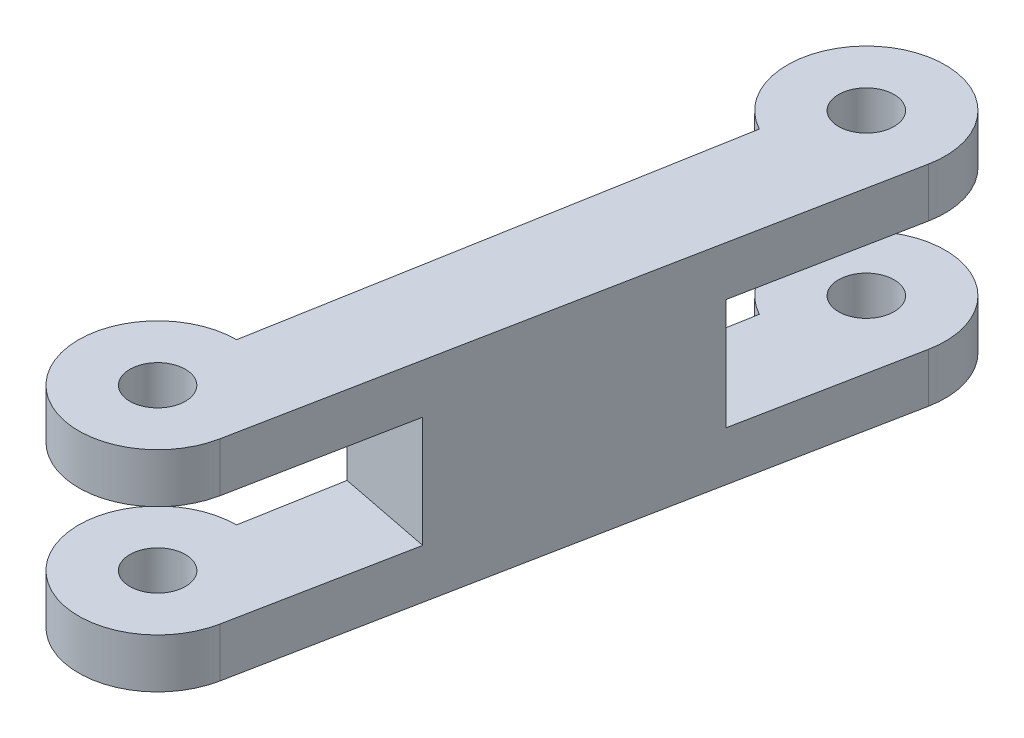
ISO-10303-21;
HEADER;
FILE_DESCRIPTION(('STEP AP214'),'2;1');
FILE_NAME('part.step','',(''),(''),'','','');
FILE_SCHEMA(('AUTOMOTIVE_DESIGN { 1 0 10303 214 1 1 1 1 }'));
ENDSEC;
DATA;
#1=APPLICATION_CONTEXT('core data for automotive mechanical design processes');
#2=APPLICATION_PROTOCOL_DEFINITION('international standard','automotive_design',2000,#1);
#3=PRODUCT_CONTEXT('',#1,'mechanical');
#4=PRODUCT('Part','Part','',(#3));
#5=PRODUCT_RELATED_PRODUCT_CATEGORY('part','',(#4));
#6=PRODUCT_DEFINITION_FORMATION('','',#4);
#7=PRODUCT_DEFINITION_CONTEXT('part definition',#1,'design');
#8=PRODUCT_DEFINITION('design','',#6,#7);
#9=PRODUCT_DEFINITION_SHAPE('','',#8);
#10=(LENGTH_UNIT() NAMED_UNIT(*) SI_UNIT(.MILLI.,.METRE.));
#11=(NAMED_UNIT(*) PLANE_ANGLE_UNIT() SI_UNIT($,.RADIAN.));
#12=(NAMED_UNIT(*) SI_UNIT($,.STERADIAN.) SOLID_ANGLE_UNIT());
#13=UNCERTAINTY_MEASURE_WITH_UNIT(LENGTH_MEASURE(1.E-05),#10,'distance_accuracy_value','');
#14=(GEOMETRIC_REPRESENTATION_CONTEXT(3) GLOBAL_UNCERTAINTY_ASSIGNED_CONTEXT((#13)) GLOBAL_UNIT_ASSIGNED_CONTEXT((#10,
#11,#12)) REPRESENTATION_CONTEXT('',''));
#15=CARTESIAN_POINT('',(0.,0.,0.));
#16=DIRECTION('',(0.,0.,1.));
#17=DIRECTION('',(1.,0.,0.));
#18=AXIS2_PLACEMENT_3D('',#15,#16,#17);
#19=CARTESIAN_POINT('',(-61.1949578899378,8.5,-40.8775039517998));
#20=DIRECTION('',(0.,-1.,0.));
#21=DIRECTION('',(0.,0.,-1.));
#22=AXIS2_PLACEMENT_3D('',#19,#20,#21);
#23=CYLINDRICAL_SURFACE('',#22,3.2);
#24=DIRECTION('',(0.,-1.,0.));
#25=VECTOR('',#24,1.);
#26=CARTESIAN_POINT('',(-58.0549880466162,8.5,-40.2605846839607));
#27=LINE('',#26,#25);
#28=CARTESIAN_POINT('',(-58.0549880466162,2.,-40.2605846839607));
#29=VERTEX_POINT('',#28);
#30=CARTESIAN_POINT('',(-58.0549880466162,0.,-40.2605846839607));
#31=VERTEX_POINT('',#30);
#32=EDGE_CURVE('E224',#29,#31,#27,.T.);
#33=ORIENTED_EDGE('',*,*,#32,.F.);
#34=CARTESIAN_POINT('',(-61.1949578899378,2.,-40.8775039517998));
#35=DIRECTION('',(0.,-1.,0.));
#36=DIRECTION('',(0.,0.,-1.));
#37=AXIS2_PLACEMENT_3D('',#34,#35,#36);
#38=CIRCLE('',#37,3.2);
#39=CARTESIAN_POINT('',(-61.1949578899378,2.,-44.0775039517998));
#40=VERTEX_POINT('',#39);
#41=EDGE_CURVE('E138',#29,#40,#38,.T.);
#42=ORIENTED_EDGE('',*,*,#41,.T.);
#43=DIRECTION('',(0.,-1.,0.));
#44=VECTOR('',#43,1.);
#45=CARTESIAN_POINT('',(-61.1949578899378,8.5,-44.0775039517998));
#46=LINE('',#45,#44);
#47=CARTESIAN_POINT('',(-61.1949578899378,0.,-44.0775039517998));
#48=VERTEX_POINT('',#47);
#49=EDGE_CURVE('E227',#40,#48,#46,.T.);
#50=ORIENTED_EDGE('',*,*,#49,.T.);
#51=CARTESIAN_POINT('',(-61.1949578899378,0.,-40.8775039517998));
#52=DIRECTION('',(0.,1.,0.));
#53=DIRECTION('',(0.,0.,1.));
#54=AXIS2_PLACEMENT_3D('',#51,#52,#53);
#55=CIRCLE('',#54,3.2);
#56=EDGE_CURVE('E216',#48,#31,#55,.T.);
#57=ORIENTED_EDGE('',*,*,#56,.T.);
#58=EDGE_LOOP('',(#33,#42,#50,#57));
#59=FACE_BOUND('',#58,.T.);
#60=ADVANCED_FACE('F33',(#59),#23,.T.);
#61=CARTESIAN_POINT('',(-61.1949578899378,8.5,-40.8775039517998));
#62=DIRECTION('',(0.,-1.,0.));
#63=DIRECTION('',(0.,0.,-1.));
#64=AXIS2_PLACEMENT_3D('',#61,#62,#63);
#65=CYLINDRICAL_SURFACE('',#64,1.125);
#66=CARTESIAN_POINT('',(-61.1949578899378,2.,-40.8775039517998));
#67=DIRECTION('',(0.,-1.,0.));
#68=DIRECTION('',(0.,0.,-1.));
#69=AXIS2_PLACEMENT_3D('',#66,#67,#68);
#70=CIRCLE('',#69,1.125);
#71=CARTESIAN_POINT('',(-61.1949578899378,2.,-42.0025039517998));
#72=VERTEX_POINT('',#71);
#73=EDGE_CURVE('E37',#72,#72,#70,.T.);
#74=ORIENTED_EDGE('',*,*,#73,.F.);
#75=EDGE_LOOP('',(#74));
#76=FACE_BOUND('',#75,.T.);
#77=CARTESIAN_POINT('',(-61.1949578899378,0.,-40.8775039517998));
#78=DIRECTION('',(0.,1.,0.));
#79=DIRECTION('',(0.,0.,1.));
#80=AXIS2_PLACEMENT_3D('',#77,#78,#79);
#81=CIRCLE('',#80,1.125);
#82=CARTESIAN_POINT('',(-61.1949578899378,0.,-39.7525039517998));
#83=VERTEX_POINT('',#82);
#84=EDGE_CURVE('E187',#83,#83,#81,.T.);
#85=ORIENTED_EDGE('',*,*,#84,.F.);
#86=EDGE_LOOP('',(#85));
#87=FACE_BOUND('',#86,.T.);
#88=ADVANCED_FACE('F246',(#76,#87),#65,.F.);
#89=CARTESIAN_POINT('',(-56.4794724284142,8.5,-64.8781842963553));
#90=DIRECTION('',(0.,-1.,0.));
#91=DIRECTION('',(0.,0.,-1.));
#92=AXIS2_PLACEMENT_3D('',#89,#90,#91);
#93=CYLINDRICAL_SURFACE('',#92,3.2);
#94=DIRECTION('',(0.,-1.,0.));
#95=VECTOR('',#94,1.);
#96=CARTESIAN_POINT('',(-53.3395025850926,8.5,-64.2612650285162));
#97=LINE('',#96,#95);
#98=CARTESIAN_POINT('',(-53.3395025850926,8.5,-64.2612650285162));
#99=VERTEX_POINT('',#98);
#100=CARTESIAN_POINT('',(-53.3395025850926,6.5,-64.2612650285162));
#101=VERTEX_POINT('',#100);
#102=EDGE_CURVE('E221',#99,#101,#97,.T.);
#103=ORIENTED_EDGE('',*,*,#102,.T.);
#104=CARTESIAN_POINT('',(-56.4794724284142,6.5,-64.8781842963553));
#105=DIRECTION('',(0.,1.,0.));
#106=DIRECTION('',(0.,0.,1.));
#107=AXIS2_PLACEMENT_3D('',#104,#105,#106);
#108=CIRCLE('',#107,3.2);
#109=CARTESIAN_POINT('',(-57.9949578899378,6.5,-62.0597975564081));
#110=VERTEX_POINT('',#109);
#111=EDGE_CURVE('E181',#101,#110,#108,.T.);
#112=ORIENTED_EDGE('',*,*,#111,.T.);
#113=DIRECTION('',(0.,-1.,0.));
#114=VECTOR('',#113,1.);
#115=CARTESIAN_POINT('',(-57.9949578899378,8.5,-62.0597975564081));
#116=LINE('',#115,#114);
#117=CARTESIAN_POINT('',(-57.9949578899378,8.5,-62.0597975564081));
#118=VERTEX_POINT('',#117);
#119=EDGE_CURVE('E11',#118,#110,#116,.T.);
#120=ORIENTED_EDGE('',*,*,#119,.F.);
#121=CARTESIAN_POINT('',(-56.4794724284142,8.5,-64.8781842963553));
#122=DIRECTION('',(0.,1.,0.));
#123=DIRECTION('',(0.,0.,1.));
#124=AXIS2_PLACEMENT_3D('',#121,#122,#123);
#125=CIRCLE('',#124,3.2);
#126=EDGE_CURVE('E200',#99,#118,#125,.T.);
#127=ORIENTED_EDGE('',*,*,#126,.F.);
#128=EDGE_LOOP('',(#103,#112,#120,#127));
#129=FACE_BOUND('',#128,.T.);
#130=ADVANCED_FACE('F261',(#129),#93,.T.);
#131=CARTESIAN_POINT('',(-56.4794724284142,8.5,-64.8781842963553));
#132=DIRECTION('',(0.,-1.,0.));
#133=DIRECTION('',(0.,0.,-1.));
#134=AXIS2_PLACEMENT_3D('',#131,#132,#133);
#135=CYLINDRICAL_SURFACE('',#134,1.125);
#136=CARTESIAN_POINT('',(-56.4794724284142,6.5,-64.8781842963553));
#137=DIRECTION('',(0.,1.,0.));
#138=DIRECTION('',(0.,0.,1.));
#139=AXIS2_PLACEMENT_3D('',#136,#137,#138);
#140=CIRCLE('',#139,1.125);
#141=CARTESIAN_POINT('',(-56.4794724284142,6.5,-63.7531842963554));
#142=VERTEX_POINT('',#141);
#143=EDGE_CURVE('E177',#142,#142,#140,.T.);
#144=ORIENTED_EDGE('',*,*,#143,.F.);
#145=EDGE_LOOP('',(#144));
#146=FACE_BOUND('',#145,.T.);
#147=CARTESIAN_POINT('',(-56.4794724284142,8.5,-64.8781842963553));
#148=DIRECTION('',(0.,1.,0.));
#149=DIRECTION('',(0.,0.,1.));
#150=AXIS2_PLACEMENT_3D('',#147,#148,#149);
#151=CIRCLE('',#150,1.125);
#152=CARTESIAN_POINT('',(-56.4794724284142,8.5,-63.7531842963554));
#153=VERTEX_POINT('',#152);
#154=EDGE_CURVE('E194',#153,#153,#151,.T.);
#155=ORIENTED_EDGE('',*,*,#154,.T.);
#156=EDGE_LOOP('',(#155));
#157=FACE_BOUND('',#156,.T.);
#158=ADVANCED_FACE('F252',(#146,#157),#135,.F.);
#159=CARTESIAN_POINT('',(-56.4794724284142,8.5,-64.8781842963553));
#160=DIRECTION('',(0.,1.,0.));
#161=DIRECTION('',(0.,0.,1.));
#162=AXIS2_PLACEMENT_3D('',#159,#160,#161);
#163=PLANE('',#162);
#164=ORIENTED_EDGE('',*,*,#154,.F.);
#165=EDGE_LOOP('',(#164));
#166=FACE_BOUND('',#165,.T.);
#167=ORIENTED_EDGE('',*,*,#126,.T.);
#168=DIRECTION('',(-0.17520039483039,0.,0.984532793588551));
#169=VECTOR('',#168,1.);
#170=CARTESIAN_POINT('',(-57.9949578899378,8.5,-62.0597975564081));
#171=LINE('',#170,#169);
#172=CARTESIAN_POINT('',(-61.1949578899378,8.5,-44.0775039517998));
#173=VERTEX_POINT('',#172);
#174=EDGE_CURVE('E203',#118,#173,#171,.T.);
#175=ORIENTED_EDGE('',*,*,#174,.T.);
#176=CARTESIAN_POINT('',(-61.1949578899378,8.5,-40.8775039517998));
#177=DIRECTION('',(0.,1.,0.));
#178=DIRECTION('',(0.,0.,1.));
#179=AXIS2_PLACEMENT_3D('',#176,#177,#178);
#180=CIRCLE('',#179,3.2);
#181=CARTESIAN_POINT('',(-58.0549880466162,8.5,-40.2605846839607));
#182=VERTEX_POINT('',#181);
#183=EDGE_CURVE('E206',#173,#182,#180,.T.);
#184=ORIENTED_EDGE('',*,*,#183,.T.);
#185=DIRECTION('',(0.192787271199743,0.,-0.981240576037985));
#186=VECTOR('',#185,1.);
#187=CARTESIAN_POINT('',(-53.3395025850926,8.5,-64.2612650285162));
#188=LINE('',#187,#186);
#189=EDGE_CURVE('E208',#182,#99,#188,.T.);
#190=ORIENTED_EDGE('',*,*,#189,.T.);
#191=EDGE_LOOP('',(#167,#175,#184,#190));
#192=FACE_BOUND('',#191,.T.);
#193=CARTESIAN_POINT('',(-61.1949578899378,8.5,-40.8775039517998));
#194=DIRECTION('',(0.,1.,0.));
#195=DIRECTION('',(0.,0.,1.));
#196=AXIS2_PLACEMENT_3D('',#193,#194,#195);
#197=CIRCLE('',#196,1.125);
#198=CARTESIAN_POINT('',(-61.1949578899378,8.5,-39.7525039517998));
#199=VERTEX_POINT('',#198);
#200=EDGE_CURVE('E188',#199,#199,#197,.T.);
#201=ORIENTED_EDGE('',*,*,#200,.F.);
#202=EDGE_LOOP('',(#201));
#203=FACE_BOUND('',#202,.T.);
#204=ADVANCED_FACE('F249',(#166,#192,#203),#163,.T.);
#205=CARTESIAN_POINT('',(-56.4794724284142,0.,-64.8781842963553));
#206=DIRECTION('',(0.,1.,0.));
#207=DIRECTION('',(0.,0.,1.));
#208=AXIS2_PLACEMENT_3D('',#205,#206,#207);
#209=PLANE('',#208);
#210=CARTESIAN_POINT('',(-56.4794724284142,0.,-64.8781842963553));
#211=DIRECTION('',(0.,1.,0.));
#212=DIRECTION('',(0.,0.,1.));
#213=AXIS2_PLACEMENT_3D('',#210,#211,#212);
#214=CIRCLE('',#213,3.2);
#215=CARTESIAN_POINT('',(-53.3395025850926,0.,-64.2612650285162));
#216=VERTEX_POINT('',#215);
#217=CARTESIAN_POINT('',(-57.9949578899378,0.,-62.0597975564081));
#218=VERTEX_POINT('',#217);
#219=EDGE_CURVE('E197',#216,#218,#214,.T.);
#220=ORIENTED_EDGE('',*,*,#219,.F.);
#221=DIRECTION('',(0.192787271199743,0.,-0.981240576037985));
#222=VECTOR('',#221,1.);
#223=CARTESIAN_POINT('',(-53.3395025850926,0.,-64.2612650285162));
#224=LINE('',#223,#222);
#225=EDGE_CURVE('E204',#31,#216,#224,.T.);
#226=ORIENTED_EDGE('',*,*,#225,.F.);
#227=ORIENTED_EDGE('',*,*,#56,.F.);
#228=DIRECTION('',(-0.17520039483039,0.,0.984532793588551));
#229=VECTOR('',#228,1.);
#230=CARTESIAN_POINT('',(-57.9949578899378,0.,-62.0597975564081));
#231=LINE('',#230,#229);
#232=EDGE_CURVE('E213',#218,#48,#231,.T.);
#233=ORIENTED_EDGE('',*,*,#232,.F.);
#234=EDGE_LOOP('',(#220,#226,#227,#233));
#235=FACE_BOUND('',#234,.T.);
#236=CARTESIAN_POINT('',(-56.4794724284142,0.,-64.8781842963553));
#237=DIRECTION('',(0.,1.,0.));
#238=DIRECTION('',(0.,0.,1.));
#239=AXIS2_PLACEMENT_3D('',#236,#237,#238);
#240=CIRCLE('',#239,1.125);
#241=CARTESIAN_POINT('',(-56.4794724284142,0.,-63.7531842963554));
#242=VERTEX_POINT('',#241);
#243=EDGE_CURVE('E191',#242,#242,#240,.T.);
#244=ORIENTED_EDGE('',*,*,#243,.T.);
#245=EDGE_LOOP('',(#244));
#246=FACE_BOUND('',#245,.T.);
#247=ORIENTED_EDGE('',*,*,#84,.T.);
#248=EDGE_LOOP('',(#247));
#249=FACE_BOUND('',#248,.T.);
#250=ADVANCED_FACE('F251',(#235,#246,#249),#209,.F.);
#251=CARTESIAN_POINT('',(-57.9949578899378,2.,-62.0597975564081));
#252=VERTEX_POINT('',#251);
#253=EDGE_CURVE('E42',#252,#218,#116,.T.);
#254=ORIENTED_EDGE('',*,*,#253,.F.);
#255=CARTESIAN_POINT('',(-56.4794724284142,2.,-64.8781842963553));
#256=DIRECTION('',(0.,-1.,0.));
#257=DIRECTION('',(0.,0.,-1.));
#258=AXIS2_PLACEMENT_3D('',#255,#256,#257);
#259=CIRCLE('',#258,3.2);
#260=CARTESIAN_POINT('',(-53.3395025850926,2.,-64.2612650285162));
#261=VERTEX_POINT('',#260);
#262=EDGE_CURVE('E174',#252,#261,#259,.T.);
#263=ORIENTED_EDGE('',*,*,#262,.T.);
#264=EDGE_CURVE('E210',#261,#216,#97,.T.);
#265=ORIENTED_EDGE('',*,*,#264,.T.);
#266=ORIENTED_EDGE('',*,*,#219,.T.);
#267=EDGE_LOOP('',(#254,#263,#265,#266));
#268=FACE_BOUND('',#267,.T.);
#269=ADVANCED_FACE('F35',(#268),#93,.T.);
#270=CARTESIAN_POINT('',(-57.9949578899378,8.5,-62.0597975564081));
#271=DIRECTION('',(0.984532793588551,0.,0.17520039483039));
#272=DIRECTION('',(0.17520039483039,0.,-0.984532793588551));
#273=AXIS2_PLACEMENT_3D('',#270,#271,#272);
#274=PLANE('',#273);
#275=ORIENTED_EDGE('',*,*,#49,.F.);
#276=DIRECTION('',(0.17520039483039,0.,-0.984532793588551));
#277=VECTOR('',#276,1.);
#278=CARTESIAN_POINT('',(-57.9949578899378,2.,-62.0597975564081));
#279=LINE('',#278,#277);
#280=CARTESIAN_POINT('',(-60.518570814194,2.,-47.8784386350458));
#281=VERTEX_POINT('',#280);
#282=EDGE_CURVE('E157',#40,#281,#279,.T.);
#283=ORIENTED_EDGE('',*,*,#282,.T.);
#284=DIRECTION('',(0.,1.,0.));
#285=VECTOR('',#284,1.);
#286=CARTESIAN_POINT('',(-60.518570814194,8.5,-47.8784386350458));
#287=LINE('',#286,#285);
#288=CARTESIAN_POINT('',(-60.518570814194,6.5,-47.8784386350458));
#289=VERTEX_POINT('',#288);
#290=EDGE_CURVE('E128',#281,#289,#287,.T.);
#291=ORIENTED_EDGE('',*,*,#290,.T.);
#292=DIRECTION('',(-0.17520039483039,0.,0.984532793588551));
#293=VECTOR('',#292,1.);
#294=CARTESIAN_POINT('',(-57.9949578899378,6.5,-62.0597975564081));
#295=LINE('',#294,#293);
#296=CARTESIAN_POINT('',(-61.1949578899378,6.5,-44.0775039517998));
#297=VERTEX_POINT('',#296);
#298=EDGE_CURVE('E153',#289,#297,#295,.T.);
#299=ORIENTED_EDGE('',*,*,#298,.T.);
#300=EDGE_CURVE('E228',#173,#297,#46,.T.);
#301=ORIENTED_EDGE('',*,*,#300,.F.);
#302=ORIENTED_EDGE('',*,*,#174,.F.);
#303=ORIENTED_EDGE('',*,*,#119,.T.);
#304=DIRECTION('',(-0.17520039483039,0.,0.984532793588551));
#305=VECTOR('',#304,1.);
#306=CARTESIAN_POINT('',(-57.9949578899378,6.5,-62.0597975564081));
#307=LINE('',#306,#305);
#308=CARTESIAN_POINT('',(-58.6857641828334,6.5,-58.1778345617959));
#309=VERTEX_POINT('',#308);
#310=EDGE_CURVE('E178',#110,#309,#307,.T.);
#311=ORIENTED_EDGE('',*,*,#310,.T.);
#312=DIRECTION('',(0.,-1.,0.));
#313=VECTOR('',#312,1.);
#314=CARTESIAN_POINT('',(-58.6857641828334,8.5,-58.1778345617959));
#315=LINE('',#314,#313);
#316=CARTESIAN_POINT('',(-58.6857641828334,2.,-58.1778345617959));
#317=VERTEX_POINT('',#316);
#318=EDGE_CURVE('E184',#309,#317,#315,.T.);
#319=ORIENTED_EDGE('',*,*,#318,.T.);
#320=DIRECTION('',(0.17520039483039,0.,-0.984532793588551));
#321=VECTOR('',#320,1.);
#322=CARTESIAN_POINT('',(-57.9949578899378,2.,-62.0597975564081));
#323=LINE('',#322,#321);
#324=EDGE_CURVE('E171',#317,#252,#323,.T.);
#325=ORIENTED_EDGE('',*,*,#324,.T.);
#326=ORIENTED_EDGE('',*,*,#253,.T.);
#327=ORIENTED_EDGE('',*,*,#232,.T.);
#328=EDGE_LOOP('',(#275,#283,#291,#299,#301,#302,#303,#311,#319,#325,#326,#327));
#329=FACE_BOUND('',#328,.T.);
#330=ADVANCED_FACE('F276',(#329),#274,.F.);
#331=ORIENTED_EDGE('',*,*,#300,.T.);
#332=CARTESIAN_POINT('',(-61.1949578899378,6.5,-40.8775039517998));
#333=DIRECTION('',(0.,1.,0.));
#334=DIRECTION('',(0.,0.,1.));
#335=AXIS2_PLACEMENT_3D('',#332,#333,#334);
#336=CIRCLE('',#335,3.2);
#337=CARTESIAN_POINT('',(-58.0549880466162,6.5,-40.2605846839607));
#338=VERTEX_POINT('',#337);
#339=EDGE_CURVE('E150',#297,#338,#336,.T.);
#340=ORIENTED_EDGE('',*,*,#339,.T.);
#341=EDGE_CURVE('E225',#182,#338,#27,.T.);
#342=ORIENTED_EDGE('',*,*,#341,.F.);
#343=ORIENTED_EDGE('',*,*,#183,.F.);
#344=EDGE_LOOP('',(#331,#340,#342,#343));
#345=FACE_BOUND('',#344,.T.);
#346=ADVANCED_FACE('F269',(#345),#23,.T.);
#347=CARTESIAN_POINT('',(-53.3395025850926,8.5,-64.2612650285162));
#348=DIRECTION('',(-0.981240576037985,0.,-0.192787271199743));
#349=DIRECTION('',(-0.192787271199743,0.,0.981240576037985));
#350=AXIS2_PLACEMENT_3D('',#347,#348,#349);
#351=PLANE('',#350);
#352=DIRECTION('',(0.,1.,0.));
#353=VECTOR('',#352,1.);
#354=CARTESIAN_POINT('',(-56.705477148218,6.5,-47.1292687162265));
#355=LINE('',#354,#353);
#356=CARTESIAN_POINT('',(-56.705477148218,2.,-47.1292687162265));
#357=VERTEX_POINT('',#356);
#358=CARTESIAN_POINT('',(-56.705477148218,6.5,-47.1292687162266));
#359=VERTEX_POINT('',#358);
#360=EDGE_CURVE('E50',#357,#359,#355,.T.);
#361=ORIENTED_EDGE('',*,*,#360,.F.);
#362=DIRECTION('',(0.192787271199743,0.,-0.981240576037985));
#363=VECTOR('',#362,1.);
#364=CARTESIAN_POINT('',(-56.705477148218,2.,-47.1292687162265));
#365=LINE('',#364,#363);
#366=EDGE_CURVE('E135',#29,#357,#365,.T.);
#367=ORIENTED_EDGE('',*,*,#366,.F.);
#368=ORIENTED_EDGE('',*,*,#32,.T.);
#369=ORIENTED_EDGE('',*,*,#225,.T.);
#370=ORIENTED_EDGE('',*,*,#264,.F.);
#371=DIRECTION('',(0.192787271199743,0.,-0.981240576037985));
#372=VECTOR('',#371,1.);
#373=CARTESIAN_POINT('',(-54.6890134834908,2.,-57.3925809962503));
#374=LINE('',#373,#372);
#375=CARTESIAN_POINT('',(-54.6890134834908,2.,-57.3925809962503));
#376=VERTEX_POINT('',#375);
#377=EDGE_CURVE('E161',#376,#261,#374,.T.);
#378=ORIENTED_EDGE('',*,*,#377,.F.);
#379=DIRECTION('',(0.,-1.,0.));
#380=VECTOR('',#379,1.);
#381=CARTESIAN_POINT('',(-54.6890134834908,6.5,-57.3925809962503));
#382=LINE('',#381,#380);
#383=CARTESIAN_POINT('',(-54.6890134834908,6.5,-57.3925809962503));
#384=VERTEX_POINT('',#383);
#385=EDGE_CURVE('E58',#384,#376,#382,.T.);
#386=ORIENTED_EDGE('',*,*,#385,.F.);
#387=DIRECTION('',(-0.192787271199743,0.,0.981240576037985));
#388=VECTOR('',#387,1.);
#389=CARTESIAN_POINT('',(-54.6890134834908,6.5,-57.3925809962503));
#390=LINE('',#389,#388);
#391=EDGE_CURVE('E163',#101,#384,#390,.T.);
#392=ORIENTED_EDGE('',*,*,#391,.F.);
#393=ORIENTED_EDGE('',*,*,#102,.F.);
#394=ORIENTED_EDGE('',*,*,#189,.F.);
#395=ORIENTED_EDGE('',*,*,#341,.T.);
#396=DIRECTION('',(-0.192787271199743,0.,0.981240576037985));
#397=VECTOR('',#396,1.);
#398=CARTESIAN_POINT('',(-56.705477148218,6.5,-47.1292687162265));
#399=LINE('',#398,#397);
#400=EDGE_CURVE('E141',#359,#338,#399,.T.);
#401=ORIENTED_EDGE('',*,*,#400,.F.);
#402=EDGE_LOOP('',(#361,#367,#368,#369,#370,#378,#386,#392,#393,#394,#395,#401));
#403=FACE_BOUND('',#402,.T.);
#404=ADVANCED_FACE('F144',(#403),#351,.F.);
#405=CARTESIAN_POINT('',(-56.4794724284142,2.,-64.8781842963553));
#406=DIRECTION('',(0.,-1.,0.));
#407=DIRECTION('',(0.,0.,-1.));
#408=AXIS2_PLACEMENT_3D('',#405,#406,#407);
#409=CIRCLE('',#408,1.125);
#410=CARTESIAN_POINT('',(-56.4794724284142,2.,-66.0031842963553));
#411=VERTEX_POINT('',#410);
#412=EDGE_CURVE('E169',#411,#411,#409,.T.);
#413=ORIENTED_EDGE('',*,*,#412,.F.);
#414=EDGE_LOOP('',(#413));
#415=FACE_BOUND('',#414,.T.);
#416=ORIENTED_EDGE('',*,*,#243,.F.);
#417=EDGE_LOOP('',(#416));
#418=FACE_BOUND('',#417,.T.);
#419=ADVANCED_FACE('F244',(#415,#418),#135,.F.);
#420=CARTESIAN_POINT('',(-61.1949578899378,6.5,-40.8775039517998));
#421=DIRECTION('',(0.,1.,0.));
#422=DIRECTION('',(0.,0.,1.));
#423=AXIS2_PLACEMENT_3D('',#420,#421,#422);
#424=CIRCLE('',#423,1.125);
#425=CARTESIAN_POINT('',(-61.1949578899378,6.5,-39.7525039517998));
#426=VERTEX_POINT('',#425);
#427=EDGE_CURVE('E131',#426,#426,#424,.T.);
#428=ORIENTED_EDGE('',*,*,#427,.F.);
#429=EDGE_LOOP('',(#428));
#430=FACE_BOUND('',#429,.T.);
#431=ORIENTED_EDGE('',*,*,#200,.T.);
#432=EDGE_LOOP('',(#431));
#433=FACE_BOUND('',#432,.T.);
#434=ADVANCED_FACE('F240',(#430,#433),#65,.F.);
#435=CARTESIAN_POINT('',(-63.0295583798137,6.5,-59.0312728014481));
#436=DIRECTION('',(-0.192787271199743,0.,0.981240576037985));
#437=DIRECTION('',(0.981240576037985,0.,0.192787271199743));
#438=AXIS2_PLACEMENT_3D('',#435,#436,#437);
#439=PLANE('',#438);
#440=DIRECTION('',(0.981240576037985,0.,0.192787271199743));
#441=VECTOR('',#440,1.);
#442=CARTESIAN_POINT('',(-63.0295583798137,6.5,-59.0312728014481));
#443=LINE('',#442,#441);
#444=EDGE_CURVE('E167',#309,#384,#443,.T.);
#445=ORIENTED_EDGE('',*,*,#444,.T.);
#446=ORIENTED_EDGE('',*,*,#385,.T.);
#447=DIRECTION('',(0.981240576037985,0.,0.192787271199743));
#448=VECTOR('',#447,1.);
#449=CARTESIAN_POINT('',(-63.0295583798137,2.,-59.0312728014481));
#450=LINE('',#449,#448);
#451=EDGE_CURVE('E166',#317,#376,#450,.T.);
#452=ORIENTED_EDGE('',*,*,#451,.F.);
#453=ORIENTED_EDGE('',*,*,#318,.F.);
#454=EDGE_LOOP('',(#445,#446,#452,#453));
#455=FACE_BOUND('',#454,.T.);
#456=ADVANCED_FACE('F243',(#455),#439,.F.);
#457=CARTESIAN_POINT('',(-63.0295583798137,6.5,-59.0312728014481));
#458=DIRECTION('',(0.,1.,0.));
#459=DIRECTION('',(0.,0.,1.));
#460=AXIS2_PLACEMENT_3D('',#457,#458,#459);
#461=PLANE('',#460);
#462=ORIENTED_EDGE('',*,*,#143,.T.);
#463=EDGE_LOOP('',(#462));
#464=FACE_BOUND('',#463,.T.);
#465=ORIENTED_EDGE('',*,*,#391,.T.);
#466=ORIENTED_EDGE('',*,*,#444,.F.);
#467=ORIENTED_EDGE('',*,*,#310,.F.);
#468=ORIENTED_EDGE('',*,*,#111,.F.);
#469=EDGE_LOOP('',(#465,#466,#467,#468));
#470=FACE_BOUND('',#469,.T.);
#471=ADVANCED_FACE('F298',(#464,#470),#461,.F.);
#472=CARTESIAN_POINT('',(-63.0295583798137,2.,-59.0312728014481));
#473=DIRECTION('',(0.,-1.,0.));
#474=DIRECTION('',(0.,0.,-1.));
#475=AXIS2_PLACEMENT_3D('',#472,#473,#474);
#476=PLANE('',#475);
#477=ORIENTED_EDGE('',*,*,#412,.T.);
#478=EDGE_LOOP('',(#477));
#479=FACE_BOUND('',#478,.T.);
#480=ORIENTED_EDGE('',*,*,#324,.F.);
#481=ORIENTED_EDGE('',*,*,#451,.T.);
#482=ORIENTED_EDGE('',*,*,#377,.T.);
#483=ORIENTED_EDGE('',*,*,#262,.F.);
#484=EDGE_LOOP('',(#480,#481,#482,#483));
#485=FACE_BOUND('',#484,.T.);
#486=ADVANCED_FACE('F297',(#479,#485),#476,.F.);
#487=CARTESIAN_POINT('',(-65.0460220445409,6.5,-48.7679605214244));
#488=DIRECTION('',(0.192787271199743,0.,-0.981240576037985));
#489=DIRECTION('',(-0.981240576037985,0.,-0.192787271199743));
#490=AXIS2_PLACEMENT_3D('',#487,#488,#489);
#491=PLANE('',#490);
#492=DIRECTION('',(0.981240576037985,0.,0.192787271199743));
#493=VECTOR('',#492,1.);
#494=CARTESIAN_POINT('',(-65.0460220445409,2.,-48.7679605214244));
#495=LINE('',#494,#493);
#496=EDGE_CURVE('E124',#281,#357,#495,.T.);
#497=ORIENTED_EDGE('',*,*,#496,.T.);
#498=ORIENTED_EDGE('',*,*,#360,.T.);
#499=DIRECTION('',(0.981240576037985,0.,0.192787271199743));
#500=VECTOR('',#499,1.);
#501=CARTESIAN_POINT('',(-65.0460220445409,6.5,-48.7679605214244));
#502=LINE('',#501,#500);
#503=EDGE_CURVE('E132',#289,#359,#502,.T.);
#504=ORIENTED_EDGE('',*,*,#503,.F.);
#505=ORIENTED_EDGE('',*,*,#290,.F.);
#506=EDGE_LOOP('',(#497,#498,#504,#505));
#507=FACE_BOUND('',#506,.T.);
#508=ADVANCED_FACE('F126',(#507),#491,.F.);
#509=CARTESIAN_POINT('',(-65.0460220445409,2.,-48.7679605214244));
#510=DIRECTION('',(0.,-1.,0.));
#511=DIRECTION('',(0.,0.,-1.));
#512=AXIS2_PLACEMENT_3D('',#509,#510,#511);
#513=PLANE('',#512);
#514=ORIENTED_EDGE('',*,*,#73,.T.);
#515=EDGE_LOOP('',(#514));
#516=FACE_BOUND('',#515,.T.);
#517=ORIENTED_EDGE('',*,*,#41,.F.);
#518=ORIENTED_EDGE('',*,*,#366,.T.);
#519=ORIENTED_EDGE('',*,*,#496,.F.);
#520=ORIENTED_EDGE('',*,*,#282,.F.);
#521=EDGE_LOOP('',(#517,#518,#519,#520));
#522=FACE_BOUND('',#521,.T.);
#523=ADVANCED_FACE('F136',(#516,#522),#513,.F.);
#524=CARTESIAN_POINT('',(-65.0460220445409,6.5,-48.7679605214244));
#525=DIRECTION('',(0.,1.,0.));
#526=DIRECTION('',(0.,0.,1.));
#527=AXIS2_PLACEMENT_3D('',#524,#525,#526);
#528=PLANE('',#527);
#529=ORIENTED_EDGE('',*,*,#427,.T.);
#530=EDGE_LOOP('',(#529));
#531=FACE_BOUND('',#530,.T.);
#532=ORIENTED_EDGE('',*,*,#503,.T.);
#533=ORIENTED_EDGE('',*,*,#400,.T.);
#534=ORIENTED_EDGE('',*,*,#339,.F.);
#535=ORIENTED_EDGE('',*,*,#298,.F.);
#536=EDGE_LOOP('',(#532,#533,#534,#535));
#537=FACE_BOUND('',#536,.T.);
#538=ADVANCED_FACE('F237',(#531,#537),#528,.F.);
#539=CLOSED_SHELL('',(#60,#88,#130,#158,#204,#250,#269,#330,#346,#404,#419,#434,#456,#471,#486,
#508,#523,#538));
#540=MANIFOLD_SOLID_BREP('B2',#539);
#541=ADVANCED_BREP_SHAPE_REPRESENTATION('',(#18,#540),#14);
#542=SHAPE_DEFINITION_REPRESENTATION(#9,#541);
ENDSEC;
END-ISO-10303-21;
